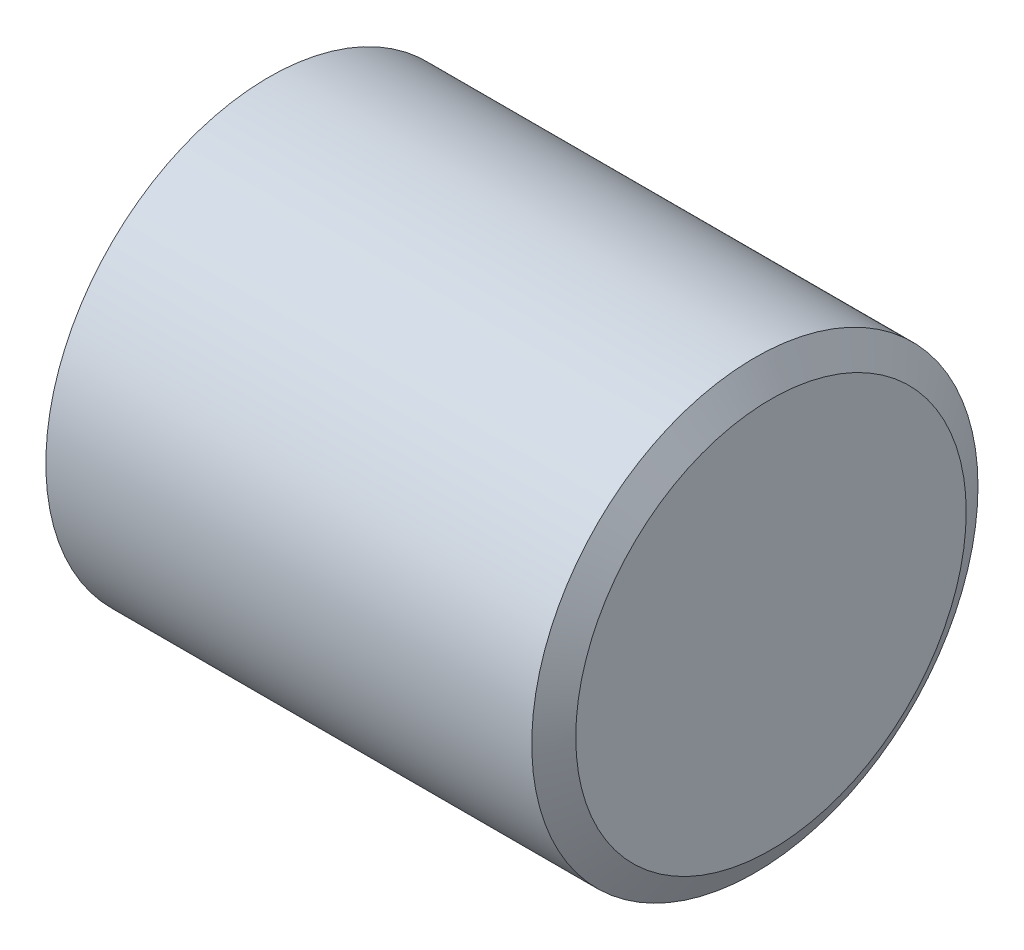
ISO-10303-21;
HEADER;
FILE_DESCRIPTION(('STEP AP214'),'2;1');
FILE_NAME('part.step','',(''),(''),'','','');
FILE_SCHEMA(('AUTOMOTIVE_DESIGN { 1 0 10303 214 1 1 1 1 }'));
ENDSEC;
DATA;
#1=APPLICATION_CONTEXT('core data for automotive mechanical design processes');
#2=APPLICATION_PROTOCOL_DEFINITION('international standard','automotive_design',2000,#1);
#3=PRODUCT_CONTEXT('',#1,'mechanical');
#4=PRODUCT('Part','Part','',(#3));
#5=PRODUCT_RELATED_PRODUCT_CATEGORY('part','',(#4));
#6=PRODUCT_DEFINITION_FORMATION('','',#4);
#7=PRODUCT_DEFINITION_CONTEXT('part definition',#1,'design');
#8=PRODUCT_DEFINITION('design','',#6,#7);
#9=PRODUCT_DEFINITION_SHAPE('','',#8);
#10=(LENGTH_UNIT() NAMED_UNIT(*) SI_UNIT(.MILLI.,.METRE.));
#11=(NAMED_UNIT(*) PLANE_ANGLE_UNIT() SI_UNIT($,.RADIAN.));
#12=(NAMED_UNIT(*) SI_UNIT($,.STERADIAN.) SOLID_ANGLE_UNIT());
#13=UNCERTAINTY_MEASURE_WITH_UNIT(LENGTH_MEASURE(1.E-05),#10,'distance_accuracy_value','');
#14=(GEOMETRIC_REPRESENTATION_CONTEXT(3) GLOBAL_UNCERTAINTY_ASSIGNED_CONTEXT((#13)) GLOBAL_UNIT_ASSIGNED_CONTEXT((#10,
#11,#12)) REPRESENTATION_CONTEXT('',''));
#15=CARTESIAN_POINT('',(0.,0.,0.));
#16=DIRECTION('',(0.,0.,1.));
#17=DIRECTION('',(1.,0.,0.));
#18=AXIS2_PLACEMENT_3D('',#15,#16,#17);
#19=CARTESIAN_POINT('',(0.,0.,0.));
#20=DIRECTION('',(1.,0.,0.));
#21=DIRECTION('',(0.,0.,-1.));
#22=AXIS2_PLACEMENT_3D('',#19,#20,#21);
#23=PLANE('',#22);
#24=CARTESIAN_POINT('',(0.,0.,0.));
#25=DIRECTION('',(1.,0.,0.));
#26=DIRECTION('',(0.,0.,-1.));
#27=AXIS2_PLACEMENT_3D('',#24,#25,#26);
#28=CIRCLE('',#27,3.5);
#29=CARTESIAN_POINT('',(0.,0.,-3.5));
#30=VERTEX_POINT('',#29);
#31=EDGE_CURVE('E50',#30,#30,#28,.T.);
#32=ORIENTED_EDGE('',*,*,#31,.T.);
#33=EDGE_LOOP('',(#32));
#34=FACE_BOUND('',#33,.T.);
#35=ADVANCED_FACE('F41',(#34),#23,.T.);
#36=CARTESIAN_POINT('',(-3.,2.5,0.));
#37=DIRECTION('',(-1.,0.,0.));
#38=DIRECTION('',(0.,0.,1.));
#39=AXIS2_PLACEMENT_3D('',#36,#37,#38);
#40=PLANE('',#39);
#41=CARTESIAN_POINT('',(-3.,0.,0.));
#42=DIRECTION('',(1.,0.,0.));
#43=DIRECTION('',(0.,0.,-1.));
#44=AXIS2_PLACEMENT_3D('',#41,#42,#43);
#45=CIRCLE('',#44,2.5);
#46=CARTESIAN_POINT('',(-3.,0.,-2.5));
#47=VERTEX_POINT('',#46);
#48=EDGE_CURVE('E55',#47,#47,#45,.T.);
#49=ORIENTED_EDGE('',*,*,#48,.F.);
#50=EDGE_LOOP('',(#49));
#51=FACE_BOUND('',#50,.T.);
#52=ADVANCED_FACE('F83',(#51),#40,.T.);
#53=CARTESIAN_POINT('',(0.,0.,0.));
#54=DIRECTION('',(1.,0.,0.));
#55=DIRECTION('',(0.,0.,-1.));
#56=AXIS2_PLACEMENT_3D('',#53,#54,#55);
#57=CYLINDRICAL_SURFACE('',#56,2.5);
#58=ORIENTED_EDGE('',*,*,#48,.T.);
#59=EDGE_LOOP('',(#58));
#60=FACE_BOUND('',#59,.T.);
#61=CARTESIAN_POINT('',(-9.,0.,0.));
#62=DIRECTION('',(1.,0.,0.));
#63=DIRECTION('',(0.,0.,-1.));
#64=AXIS2_PLACEMENT_3D('',#61,#62,#63);
#65=CIRCLE('',#64,2.5);
#66=CARTESIAN_POINT('',(-9.,0.,-2.5));
#67=VERTEX_POINT('',#66);
#68=EDGE_CURVE('E60',#67,#67,#65,.T.);
#69=ORIENTED_EDGE('',*,*,#68,.F.);
#70=EDGE_LOOP('',(#69));
#71=FACE_BOUND('',#70,.T.);
#72=ADVANCED_FACE('F75',(#60,#71),#57,.F.);
#73=CARTESIAN_POINT('',(-9.,2.5,0.));
#74=DIRECTION('',(-1.,0.,0.));
#75=DIRECTION('',(0.,0.,1.));
#76=AXIS2_PLACEMENT_3D('',#73,#74,#75);
#77=PLANE('',#76);
#78=ORIENTED_EDGE('',*,*,#68,.T.);
#79=EDGE_LOOP('',(#78));
#80=FACE_BOUND('',#79,.T.);
#81=CARTESIAN_POINT('',(-9.,0.,0.));
#82=DIRECTION('',(1.,0.,0.));
#83=DIRECTION('',(0.,0.,-1.));
#84=AXIS2_PLACEMENT_3D('',#81,#82,#83);
#85=CIRCLE('',#84,4.);
#86=CARTESIAN_POINT('',(-9.,0.,-4.));
#87=VERTEX_POINT('',#86);
#88=EDGE_CURVE('E66',#87,#87,#85,.T.);
#89=ORIENTED_EDGE('',*,*,#88,.F.);
#90=EDGE_LOOP('',(#89));
#91=FACE_BOUND('',#90,.T.);
#92=ADVANCED_FACE('F73',(#80,#91),#77,.T.);
#93=CARTESIAN_POINT('',(0.,0.,0.));
#94=DIRECTION('',(1.,0.,0.));
#95=DIRECTION('',(0.,0.,-1.));
#96=AXIS2_PLACEMENT_3D('',#93,#94,#95);
#97=CYLINDRICAL_SURFACE('',#96,4.);
#98=CARTESIAN_POINT('',(-0.288675134594812,0.,0.));
#99=DIRECTION('',(1.,0.,0.));
#100=DIRECTION('',(0.,0.,-1.));
#101=AXIS2_PLACEMENT_3D('',#98,#99,#100);
#102=CIRCLE('',#101,4.);
#103=CARTESIAN_POINT('',(-0.288675134594812,0.,-4.));
#104=VERTEX_POINT('',#103);
#105=EDGE_CURVE('E10',#104,#104,#102,.F.);
#106=ORIENTED_EDGE('',*,*,#105,.T.);
#107=EDGE_LOOP('',(#106));
#108=FACE_BOUND('',#107,.T.);
#109=ORIENTED_EDGE('',*,*,#88,.T.);
#110=EDGE_LOOP('',(#109));
#111=FACE_BOUND('',#110,.T.);
#112=ADVANCED_FACE('F71',(#108,#111),#97,.T.);
#113=CARTESIAN_POINT('',(0.,0.,0.));
#114=DIRECTION('',(-1.,0.,0.));
#115=DIRECTION('',(0.,0.,1.));
#116=AXIS2_PLACEMENT_3D('',#113,#114,#115);
#117=CONICAL_SURFACE('',#116,3.5,1.0471975511966);
#118=ORIENTED_EDGE('',*,*,#105,.F.);
#119=EDGE_LOOP('',(#118));
#120=FACE_BOUND('',#119,.T.);
#121=ORIENTED_EDGE('',*,*,#31,.F.);
#122=EDGE_LOOP('',(#121));
#123=FACE_BOUND('',#122,.T.);
#124=ADVANCED_FACE('F44',(#120,#123),#117,.T.);
#125=CLOSED_SHELL('',(#35,#52,#72,#92,#112,#124));
#126=MANIFOLD_SOLID_BREP('B2',#125);
#127=ADVANCED_BREP_SHAPE_REPRESENTATION('',(#18,#126),#14);
#128=SHAPE_DEFINITION_REPRESENTATION(#9,#127);
ENDSEC;
END-ISO-10303-21;
